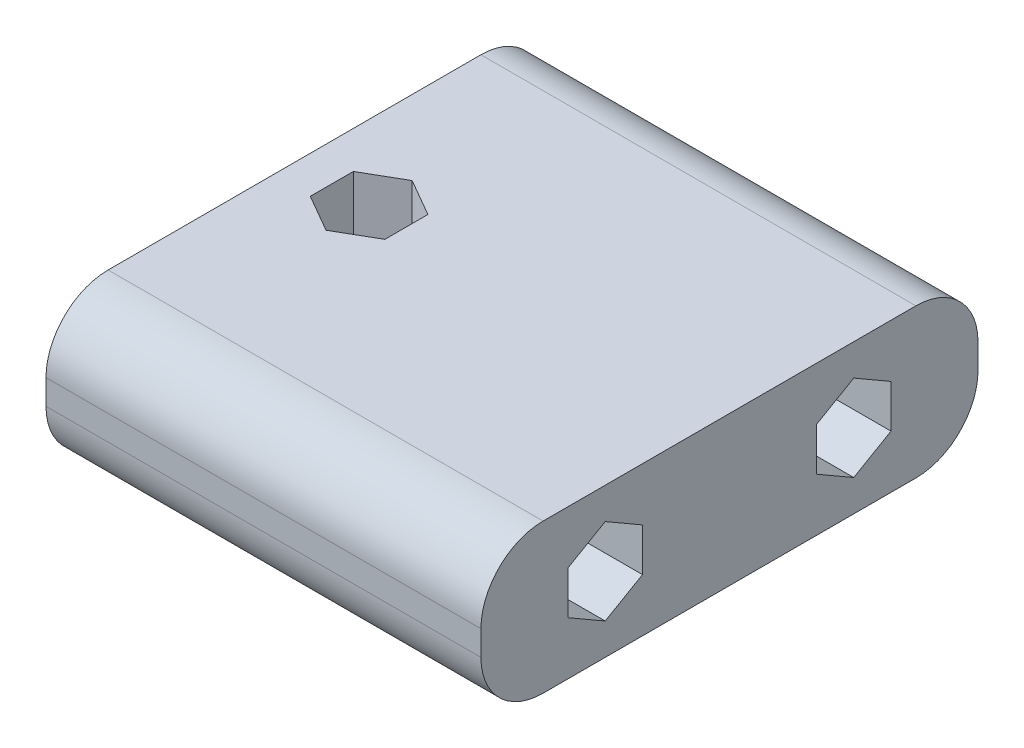
ISO-10303-21;
HEADER;
FILE_DESCRIPTION(('STEP AP214'),'2;1');
FILE_NAME('part.step','',(''),(''),'','','');
FILE_SCHEMA(('AUTOMOTIVE_DESIGN { 1 0 10303 214 1 1 1 1 }'));
ENDSEC;
DATA;
#1=APPLICATION_CONTEXT('core data for automotive mechanical design processes');
#2=APPLICATION_PROTOCOL_DEFINITION('international standard','automotive_design',2000,#1);
#3=PRODUCT_CONTEXT('',#1,'mechanical');
#4=PRODUCT('Part','Part','',(#3));
#5=PRODUCT_RELATED_PRODUCT_CATEGORY('part','',(#4));
#6=PRODUCT_DEFINITION_FORMATION('','',#4);
#7=PRODUCT_DEFINITION_CONTEXT('part definition',#1,'design');
#8=PRODUCT_DEFINITION('design','',#6,#7);
#9=PRODUCT_DEFINITION_SHAPE('','',#8);
#10=(LENGTH_UNIT() NAMED_UNIT(*) SI_UNIT(.MILLI.,.METRE.));
#11=(NAMED_UNIT(*) PLANE_ANGLE_UNIT() SI_UNIT($,.RADIAN.));
#12=(NAMED_UNIT(*) SI_UNIT($,.STERADIAN.) SOLID_ANGLE_UNIT());
#13=UNCERTAINTY_MEASURE_WITH_UNIT(LENGTH_MEASURE(1.E-05),#10,'distance_accuracy_value','');
#14=(GEOMETRIC_REPRESENTATION_CONTEXT(3) GLOBAL_UNCERTAINTY_ASSIGNED_CONTEXT((#13)) GLOBAL_UNIT_ASSIGNED_CONTEXT((#10,
#11,#12)) REPRESENTATION_CONTEXT('',''));
#15=CARTESIAN_POINT('',(0.,0.,0.));
#16=DIRECTION('',(0.,0.,1.));
#17=DIRECTION('',(1.,0.,0.));
#18=AXIS2_PLACEMENT_3D('',#15,#16,#17);
#19=CARTESIAN_POINT('',(35.,0.,0.));
#20=DIRECTION('',(-1.,0.,0.));
#21=DIRECTION('',(0.,0.,1.));
#22=AXIS2_PLACEMENT_3D('',#19,#20,#21);
#23=PLANE('',#22);
#24=DIRECTION('',(0.,0.5,0.866025403784439));
#25=VECTOR('',#24,1.);
#26=CARTESIAN_POINT('',(35.,7.73205080756886,-33.));
#27=LINE('',#26,#25);
#28=CARTESIAN_POINT('',(35.,7.73205080756886,-33.));
#29=VERTEX_POINT('',#28);
#30=CARTESIAN_POINT('',(35.,9.46410161513774,-30.));
#31=VERTEX_POINT('',#30);
#32=EDGE_CURVE('E301',#29,#31,#27,.T.);
#33=ORIENTED_EDGE('',*,*,#32,.F.);
#34=DIRECTION('',(0.,1.,0.));
#35=VECTOR('',#34,1.);
#36=CARTESIAN_POINT('',(35.,4.26794919243112,-33.));
#37=LINE('',#36,#35);
#38=CARTESIAN_POINT('',(35.,4.26794919243112,-33.));
#39=VERTEX_POINT('',#38);
#40=EDGE_CURVE('E312',#39,#29,#37,.T.);
#41=ORIENTED_EDGE('',*,*,#40,.F.);
#42=DIRECTION('',(0.,0.5,-0.866025403784438));
#43=VECTOR('',#42,1.);
#44=CARTESIAN_POINT('',(35.,2.53589838486224,-30.));
#45=LINE('',#44,#43);
#46=CARTESIAN_POINT('',(35.,2.53589838486224,-30.));
#47=VERTEX_POINT('',#46);
#48=EDGE_CURVE('E309',#47,#39,#45,.T.);
#49=ORIENTED_EDGE('',*,*,#48,.F.);
#50=DIRECTION('',(0.,-0.500000000000001,-0.866025403784438));
#51=VECTOR('',#50,1.);
#52=CARTESIAN_POINT('',(35.,4.26794919243112,-27.));
#53=LINE('',#52,#51);
#54=CARTESIAN_POINT('',(35.,4.26794919243112,-27.));
#55=VERTEX_POINT('',#54);
#56=EDGE_CURVE('E307',#55,#47,#53,.T.);
#57=ORIENTED_EDGE('',*,*,#56,.F.);
#58=DIRECTION('',(0.,-1.,0.));
#59=VECTOR('',#58,1.);
#60=CARTESIAN_POINT('',(35.,7.73205080756887,-27.));
#61=LINE('',#60,#59);
#62=CARTESIAN_POINT('',(35.,7.73205080756887,-27.));
#63=VERTEX_POINT('',#62);
#64=EDGE_CURVE('E305',#63,#55,#61,.T.);
#65=ORIENTED_EDGE('',*,*,#64,.F.);
#66=DIRECTION('',(0.,-0.5,0.866025403784439));
#67=VECTOR('',#66,1.);
#68=CARTESIAN_POINT('',(35.,9.46410161513774,-30.));
#69=LINE('',#68,#67);
#70=EDGE_CURVE('E303',#31,#63,#69,.T.);
#71=ORIENTED_EDGE('',*,*,#70,.F.);
#72=EDGE_LOOP('',(#33,#41,#49,#57,#65,#71));
#73=FACE_BOUND('',#72,.T.);
#74=DIRECTION('',(0.,0.,-1.));
#75=VECTOR('',#74,1.);
#76=CARTESIAN_POINT('',(35.,0.,0.));
#77=LINE('',#76,#75);
#78=CARTESIAN_POINT('',(35.,0.,-5.));
#79=VERTEX_POINT('',#78);
#80=CARTESIAN_POINT('',(35.,0.,-35.));
#81=VERTEX_POINT('',#80);
#82=EDGE_CURVE('E335',#79,#81,#77,.T.);
#83=ORIENTED_EDGE('',*,*,#82,.T.);
#84=CARTESIAN_POINT('',(35.,5.,-35.));
#85=DIRECTION('',(-1.,0.,0.));
#86=DIRECTION('',(0.,0.,1.));
#87=AXIS2_PLACEMENT_3D('',#84,#85,#86);
#88=CIRCLE('',#87,5.);
#89=CARTESIAN_POINT('',(35.,5.,-40.));
#90=VERTEX_POINT('',#89);
#91=EDGE_CURVE('E379',#81,#90,#88,.F.);
#92=ORIENTED_EDGE('',*,*,#91,.T.);
#93=DIRECTION('',(0.,1.,0.));
#94=VECTOR('',#93,1.);
#95=CARTESIAN_POINT('',(35.,0.,-40.));
#96=LINE('',#95,#94);
#97=CARTESIAN_POINT('',(35.,7.,-40.));
#98=VERTEX_POINT('',#97);
#99=EDGE_CURVE('E339',#90,#98,#96,.T.);
#100=ORIENTED_EDGE('',*,*,#99,.T.);
#101=CARTESIAN_POINT('',(35.,7.,-35.));
#102=DIRECTION('',(-1.,0.,0.));
#103=DIRECTION('',(0.,0.,1.));
#104=AXIS2_PLACEMENT_3D('',#101,#102,#103);
#105=CIRCLE('',#104,5.);
#106=CARTESIAN_POINT('',(35.,12.,-35.));
#107=VERTEX_POINT('',#106);
#108=EDGE_CURVE('E377',#98,#107,#105,.F.);
#109=ORIENTED_EDGE('',*,*,#108,.T.);
#110=DIRECTION('',(0.,0.,1.));
#111=VECTOR('',#110,1.);
#112=CARTESIAN_POINT('',(35.,12.,0.));
#113=LINE('',#112,#111);
#114=CARTESIAN_POINT('',(35.,12.,-5.));
#115=VERTEX_POINT('',#114);
#116=EDGE_CURVE('E342',#107,#115,#113,.T.);
#117=ORIENTED_EDGE('',*,*,#116,.T.);
#118=CARTESIAN_POINT('',(35.,7.,-5.));
#119=DIRECTION('',(-1.,0.,0.));
#120=DIRECTION('',(0.,0.,1.));
#121=AXIS2_PLACEMENT_3D('',#118,#119,#120);
#122=CIRCLE('',#121,5.);
#123=CARTESIAN_POINT('',(35.,7.,0.));
#124=VERTEX_POINT('',#123);
#125=EDGE_CURVE('E373',#115,#124,#122,.F.);
#126=ORIENTED_EDGE('',*,*,#125,.T.);
#127=DIRECTION('',(0.,-1.,0.));
#128=VECTOR('',#127,1.);
#129=CARTESIAN_POINT('',(35.,0.,0.));
#130=LINE('',#129,#128);
#131=CARTESIAN_POINT('',(35.,5.,0.));
#132=VERTEX_POINT('',#131);
#133=EDGE_CURVE('E332',#124,#132,#130,.T.);
#134=ORIENTED_EDGE('',*,*,#133,.T.);
#135=CARTESIAN_POINT('',(35.,5.,-5.));
#136=DIRECTION('',(-1.,0.,0.));
#137=DIRECTION('',(0.,0.,1.));
#138=AXIS2_PLACEMENT_3D('',#135,#136,#137);
#139=CIRCLE('',#138,5.);
#140=EDGE_CURVE('E375',#132,#79,#139,.F.);
#141=ORIENTED_EDGE('',*,*,#140,.T.);
#142=EDGE_LOOP('',(#83,#92,#100,#109,#117,#126,#134,#141));
#143=FACE_BOUND('',#142,.T.);
#144=DIRECTION('',(0.,0.5,0.866025403784438));
#145=VECTOR('',#144,1.);
#146=CARTESIAN_POINT('',(35.,7.73205080756888,-13.));
#147=LINE('',#146,#145);
#148=CARTESIAN_POINT('',(35.,7.73205080756888,-13.));
#149=VERTEX_POINT('',#148);
#150=CARTESIAN_POINT('',(35.,9.46410161513776,-10.));
#151=VERTEX_POINT('',#150);
#152=EDGE_CURVE('E270',#149,#151,#147,.T.);
#153=ORIENTED_EDGE('',*,*,#152,.F.);
#154=DIRECTION('',(0.,1.,0.));
#155=VECTOR('',#154,1.);
#156=CARTESIAN_POINT('',(35.,4.26794919243113,-13.));
#157=LINE('',#156,#155);
#158=CARTESIAN_POINT('',(35.,4.26794919243113,-13.));
#159=VERTEX_POINT('',#158);
#160=EDGE_CURVE('E215',#159,#149,#157,.T.);
#161=ORIENTED_EDGE('',*,*,#160,.F.);
#162=DIRECTION('',(0.,0.5,-0.866025403784439));
#163=VECTOR('',#162,1.);
#164=CARTESIAN_POINT('',(35.,2.53589838486225,-10.));
#165=LINE('',#164,#163);
#166=CARTESIAN_POINT('',(35.,2.53589838486225,-10.));
#167=VERTEX_POINT('',#166);
#168=EDGE_CURVE('E288',#167,#159,#165,.T.);
#169=ORIENTED_EDGE('',*,*,#168,.F.);
#170=DIRECTION('',(0.,-0.5,-0.866025403784438));
#171=VECTOR('',#170,1.);
#172=CARTESIAN_POINT('',(35.,4.26794919243112,-7.));
#173=LINE('',#172,#171);
#174=CARTESIAN_POINT('',(35.,4.26794919243112,-7.));
#175=VERTEX_POINT('',#174);
#176=EDGE_CURVE('E286',#175,#167,#173,.T.);
#177=ORIENTED_EDGE('',*,*,#176,.F.);
#178=DIRECTION('',(0.,-1.,0.));
#179=VECTOR('',#178,1.);
#180=CARTESIAN_POINT('',(35.,7.73205080756887,-7.));
#181=LINE('',#180,#179);
#182=CARTESIAN_POINT('',(35.,7.73205080756887,-7.));
#183=VERTEX_POINT('',#182);
#184=EDGE_CURVE('E284',#183,#175,#181,.T.);
#185=ORIENTED_EDGE('',*,*,#184,.F.);
#186=DIRECTION('',(0.,-0.500000000000001,0.866025403784438));
#187=VECTOR('',#186,1.);
#188=CARTESIAN_POINT('',(35.,9.46410161513776,-10.));
#189=LINE('',#188,#187);
#190=EDGE_CURVE('E282',#151,#183,#189,.T.);
#191=ORIENTED_EDGE('',*,*,#190,.F.);
#192=EDGE_LOOP('',(#153,#161,#169,#177,#185,#191));
#193=FACE_BOUND('',#192,.T.);
#194=ADVANCED_FACE('F33',(#73,#143,#193),#23,.F.);
#195=CARTESIAN_POINT('',(0.,0.,0.));
#196=DIRECTION('',(-1.,0.,0.));
#197=DIRECTION('',(0.,0.,1.));
#198=AXIS2_PLACEMENT_3D('',#195,#196,#197);
#199=PLANE('',#198);
#200=DIRECTION('',(0.,1.,0.));
#201=VECTOR('',#200,1.);
#202=CARTESIAN_POINT('',(0.,0.,-40.));
#203=LINE('',#202,#201);
#204=CARTESIAN_POINT('',(0.,5.,-40.));
#205=VERTEX_POINT('',#204);
#206=CARTESIAN_POINT('',(0.,7.,-40.));
#207=VERTEX_POINT('',#206);
#208=EDGE_CURVE('E351',#205,#207,#203,.T.);
#209=ORIENTED_EDGE('',*,*,#208,.F.);
#210=CARTESIAN_POINT('',(0.,5.,-35.));
#211=DIRECTION('',(-1.,0.,0.));
#212=DIRECTION('',(0.,0.,1.));
#213=AXIS2_PLACEMENT_3D('',#210,#211,#212);
#214=CIRCLE('',#213,5.);
#215=CARTESIAN_POINT('',(0.,0.,-35.));
#216=VERTEX_POINT('',#215);
#217=EDGE_CURVE('E366',#205,#216,#214,.T.);
#218=ORIENTED_EDGE('',*,*,#217,.T.);
#219=DIRECTION('',(0.,0.,-1.));
#220=VECTOR('',#219,1.);
#221=CARTESIAN_POINT('',(0.,0.,0.));
#222=LINE('',#221,#220);
#223=CARTESIAN_POINT('',(0.,0.,-5.));
#224=VERTEX_POINT('',#223);
#225=EDGE_CURVE('E348',#224,#216,#222,.T.);
#226=ORIENTED_EDGE('',*,*,#225,.F.);
#227=CARTESIAN_POINT('',(0.,5.,-5.));
#228=DIRECTION('',(-1.,0.,0.));
#229=DIRECTION('',(0.,0.,1.));
#230=AXIS2_PLACEMENT_3D('',#227,#228,#229);
#231=CIRCLE('',#230,5.);
#232=CARTESIAN_POINT('',(0.,5.,0.));
#233=VERTEX_POINT('',#232);
#234=EDGE_CURVE('E362',#224,#233,#231,.T.);
#235=ORIENTED_EDGE('',*,*,#234,.T.);
#236=DIRECTION('',(0.,-1.,0.));
#237=VECTOR('',#236,1.);
#238=CARTESIAN_POINT('',(0.,0.,0.));
#239=LINE('',#238,#237);
#240=CARTESIAN_POINT('',(0.,7.,0.));
#241=VERTEX_POINT('',#240);
#242=EDGE_CURVE('E331',#241,#233,#239,.T.);
#243=ORIENTED_EDGE('',*,*,#242,.F.);
#244=CARTESIAN_POINT('',(0.,7.,-5.));
#245=DIRECTION('',(-1.,0.,0.));
#246=DIRECTION('',(0.,0.,1.));
#247=AXIS2_PLACEMENT_3D('',#244,#245,#246);
#248=CIRCLE('',#247,5.);
#249=CARTESIAN_POINT('',(0.,12.,-5.));
#250=VERTEX_POINT('',#249);
#251=EDGE_CURVE('E360',#241,#250,#248,.T.);
#252=ORIENTED_EDGE('',*,*,#251,.T.);
#253=DIRECTION('',(0.,0.,1.));
#254=VECTOR('',#253,1.);
#255=CARTESIAN_POINT('',(0.,12.,0.));
#256=LINE('',#255,#254);
#257=CARTESIAN_POINT('',(0.,12.,-35.));
#258=VERTEX_POINT('',#257);
#259=EDGE_CURVE('E336',#258,#250,#256,.T.);
#260=ORIENTED_EDGE('',*,*,#259,.F.);
#261=CARTESIAN_POINT('',(0.,7.,-35.));
#262=DIRECTION('',(-1.,0.,0.));
#263=DIRECTION('',(0.,0.,1.));
#264=AXIS2_PLACEMENT_3D('',#261,#262,#263);
#265=CIRCLE('',#264,5.);
#266=EDGE_CURVE('E364',#258,#207,#265,.T.);
#267=ORIENTED_EDGE('',*,*,#266,.T.);
#268=EDGE_LOOP('',(#209,#218,#226,#235,#243,#252,#260,#267));
#269=FACE_BOUND('',#268,.T.);
#270=ADVANCED_FACE('F442',(#269),#199,.T.);
#271=CARTESIAN_POINT('',(35.,0.,0.));
#272=DIRECTION('',(0.,0.,-1.));
#273=DIRECTION('',(-1.,0.,0.));
#274=AXIS2_PLACEMENT_3D('',#271,#272,#273);
#275=PLANE('',#274);
#276=ORIENTED_EDGE('',*,*,#242,.T.);
#277=DIRECTION('',(-1.,0.,0.));
#278=VECTOR('',#277,1.);
#279=CARTESIAN_POINT('',(35.,5.,0.));
#280=LINE('',#279,#278);
#281=EDGE_CURVE('E389',#233,#132,#280,.F.);
#282=ORIENTED_EDGE('',*,*,#281,.T.);
#283=ORIENTED_EDGE('',*,*,#133,.F.);
#284=DIRECTION('',(-1.,0.,0.));
#285=VECTOR('',#284,1.);
#286=CARTESIAN_POINT('',(35.,7.,0.));
#287=LINE('',#286,#285);
#288=EDGE_CURVE('E386',#124,#241,#287,.T.);
#289=ORIENTED_EDGE('',*,*,#288,.T.);
#290=EDGE_LOOP('',(#276,#282,#283,#289));
#291=FACE_BOUND('',#290,.T.);
#292=ADVANCED_FACE('F448',(#291),#275,.F.);
#293=CARTESIAN_POINT('',(35.,0.,0.));
#294=DIRECTION('',(0.,1.,0.));
#295=DIRECTION('',(0.,0.,1.));
#296=AXIS2_PLACEMENT_3D('',#293,#294,#295);
#297=PLANE('',#296);
#298=DIRECTION('',(-0.866025403784439,0.,-0.5));
#299=VECTOR('',#298,1.);
#300=CARTESIAN_POINT('',(6.,0.,-16.5358983848622));
#301=LINE('',#300,#299);
#302=CARTESIAN_POINT('',(6.,0.,-16.5358983848622));
#303=VERTEX_POINT('',#302);
#304=CARTESIAN_POINT('',(3.,0.,-18.2679491924311));
#305=VERTEX_POINT('',#304);
#306=EDGE_CURVE('E252',#303,#305,#301,.T.);
#307=ORIENTED_EDGE('',*,*,#306,.F.);
#308=DIRECTION('',(-0.866025403784439,0.,0.5));
#309=VECTOR('',#308,1.);
#310=CARTESIAN_POINT('',(9.00000000000001,0.,-18.2679491924311));
#311=LINE('',#310,#309);
#312=CARTESIAN_POINT('',(9.00000000000001,0.,-18.2679491924311));
#313=VERTEX_POINT('',#312);
#314=EDGE_CURVE('E250',#313,#303,#311,.T.);
#315=ORIENTED_EDGE('',*,*,#314,.F.);
#316=DIRECTION('',(0.,0.,1.));
#317=VECTOR('',#316,1.);
#318=CARTESIAN_POINT('',(9.00000000000001,0.,-21.7320508075689));
#319=LINE('',#318,#317);
#320=CARTESIAN_POINT('',(9.00000000000001,0.,-21.7320508075689));
#321=VERTEX_POINT('',#320);
#322=EDGE_CURVE('E264',#321,#313,#319,.T.);
#323=ORIENTED_EDGE('',*,*,#322,.F.);
#324=DIRECTION('',(0.866025403784438,0.,0.5));
#325=VECTOR('',#324,1.);
#326=CARTESIAN_POINT('',(6.,0.,-23.4641016151378));
#327=LINE('',#326,#325);
#328=CARTESIAN_POINT('',(6.,0.,-23.4641016151378));
#329=VERTEX_POINT('',#328);
#330=EDGE_CURVE('E261',#329,#321,#327,.T.);
#331=ORIENTED_EDGE('',*,*,#330,.F.);
#332=DIRECTION('',(0.866025403784438,0.,-0.5));
#333=VECTOR('',#332,1.);
#334=CARTESIAN_POINT('',(3.,0.,-21.7320508075689));
#335=LINE('',#334,#333);
#336=CARTESIAN_POINT('',(3.,0.,-21.7320508075689));
#337=VERTEX_POINT('',#336);
#338=EDGE_CURVE('E258',#337,#329,#335,.T.);
#339=ORIENTED_EDGE('',*,*,#338,.F.);
#340=DIRECTION('',(0.,0.,-1.));
#341=VECTOR('',#340,1.);
#342=CARTESIAN_POINT('',(3.,0.,-18.2679491924311));
#343=LINE('',#342,#341);
#344=EDGE_CURVE('E255',#305,#337,#343,.T.);
#345=ORIENTED_EDGE('',*,*,#344,.F.);
#346=EDGE_LOOP('',(#307,#315,#323,#331,#339,#345));
#347=FACE_BOUND('',#346,.T.);
#348=ORIENTED_EDGE('',*,*,#225,.T.);
#349=DIRECTION('',(-1.,0.,0.));
#350=VECTOR('',#349,1.);
#351=CARTESIAN_POINT('',(35.,0.,-35.));
#352=LINE('',#351,#350);
#353=EDGE_CURVE('E371',#216,#81,#352,.F.);
#354=ORIENTED_EDGE('',*,*,#353,.T.);
#355=ORIENTED_EDGE('',*,*,#82,.F.);
#356=DIRECTION('',(-1.,0.,0.));
#357=VECTOR('',#356,1.);
#358=CARTESIAN_POINT('',(35.,0.,-5.));
#359=LINE('',#358,#357);
#360=EDGE_CURVE('E368',#79,#224,#359,.T.);
#361=ORIENTED_EDGE('',*,*,#360,.T.);
#362=EDGE_LOOP('',(#348,#354,#355,#361));
#363=FACE_BOUND('',#362,.T.);
#364=ADVANCED_FACE('F419',(#347,#363),#297,.F.);
#365=CARTESIAN_POINT('',(35.,0.,-40.));
#366=DIRECTION('',(0.,0.,1.));
#367=DIRECTION('',(1.,0.,0.));
#368=AXIS2_PLACEMENT_3D('',#365,#366,#367);
#369=PLANE('',#368);
#370=ORIENTED_EDGE('',*,*,#99,.F.);
#371=DIRECTION('',(-1.,0.,0.));
#372=VECTOR('',#371,1.);
#373=CARTESIAN_POINT('',(35.,5.,-40.));
#374=LINE('',#373,#372);
#375=EDGE_CURVE('E357',#90,#205,#374,.T.);
#376=ORIENTED_EDGE('',*,*,#375,.T.);
#377=ORIENTED_EDGE('',*,*,#208,.T.);
#378=DIRECTION('',(-1.,0.,0.));
#379=VECTOR('',#378,1.);
#380=CARTESIAN_POINT('',(35.,7.,-40.));
#381=LINE('',#380,#379);
#382=EDGE_CURVE('E345',#207,#98,#381,.F.);
#383=ORIENTED_EDGE('',*,*,#382,.T.);
#384=EDGE_LOOP('',(#370,#376,#377,#383));
#385=FACE_BOUND('',#384,.T.);
#386=ADVANCED_FACE('F459',(#385),#369,.F.);
#387=CARTESIAN_POINT('',(35.,12.,0.));
#388=DIRECTION('',(0.,-1.,0.));
#389=DIRECTION('',(0.,0.,-1.));
#390=AXIS2_PLACEMENT_3D('',#387,#388,#389);
#391=PLANE('',#390);
#392=DIRECTION('',(0.,0.,1.));
#393=VECTOR('',#392,1.);
#394=CARTESIAN_POINT('',(9.00000000000001,12.,0.));
#395=LINE('',#394,#393);
#396=CARTESIAN_POINT('',(9.00000000000001,12.,-21.7320508075689));
#397=VERTEX_POINT('',#396);
#398=CARTESIAN_POINT('',(9.00000000000001,12.,-18.2679491924311));
#399=VERTEX_POINT('',#398);
#400=EDGE_CURVE('E41',#397,#399,#395,.T.);
#401=ORIENTED_EDGE('',*,*,#400,.T.);
#402=DIRECTION('',(-0.866025403784439,0.,0.5));
#403=VECTOR('',#402,1.);
#404=CARTESIAN_POINT('',(20.5897459621556,12.,-24.959292143521));
#405=LINE('',#404,#403);
#406=CARTESIAN_POINT('',(6.,12.,-16.5358983848622));
#407=VERTEX_POINT('',#406);
#408=EDGE_CURVE('E11',#399,#407,#405,.T.);
#409=ORIENTED_EDGE('',*,*,#408,.T.);
#410=DIRECTION('',(-0.866025403784439,0.,-0.5));
#411=VECTOR('',#410,1.);
#412=CARTESIAN_POINT('',(34.9102540378444,12.,0.155444566227682));
#413=LINE('',#412,#411);
#414=CARTESIAN_POINT('',(3.,12.,-18.2679491924311));
#415=VERTEX_POINT('',#414);
#416=EDGE_CURVE('E391',#407,#415,#413,.T.);
#417=ORIENTED_EDGE('',*,*,#416,.T.);
#418=DIRECTION('',(0.,0.,-1.));
#419=VECTOR('',#418,1.);
#420=CARTESIAN_POINT('',(3.,12.,0.));
#421=LINE('',#420,#419);
#422=CARTESIAN_POINT('',(3.,12.,-21.7320508075689));
#423=VERTEX_POINT('',#422);
#424=EDGE_CURVE('E394',#415,#423,#421,.T.);
#425=ORIENTED_EDGE('',*,*,#424,.T.);
#426=DIRECTION('',(0.866025403784438,0.,-0.500000000000001));
#427=VECTOR('',#426,1.);
#428=CARTESIAN_POINT('',(17.5897459621556,12.,-30.1554445662277));
#429=LINE('',#428,#427);
#430=CARTESIAN_POINT('',(6.,12.,-23.4641016151378));
#431=VERTEX_POINT('',#430);
#432=EDGE_CURVE('E397',#423,#431,#429,.T.);
#433=ORIENTED_EDGE('',*,*,#432,.T.);
#434=DIRECTION('',(0.866025403784439,0.,0.5));
#435=VECTOR('',#434,1.);
#436=CARTESIAN_POINT('',(37.9102540378444,12.,-5.04070785647895));
#437=LINE('',#436,#435);
#438=EDGE_CURVE('E400',#431,#397,#437,.T.);
#439=ORIENTED_EDGE('',*,*,#438,.T.);
#440=EDGE_LOOP('',(#401,#409,#417,#425,#433,#439));
#441=FACE_BOUND('',#440,.T.);
#442=ORIENTED_EDGE('',*,*,#116,.F.);
#443=DIRECTION('',(-1.,0.,0.));
#444=VECTOR('',#443,1.);
#445=CARTESIAN_POINT('',(35.,12.,-35.));
#446=LINE('',#445,#444);
#447=EDGE_CURVE('E383',#107,#258,#446,.T.);
#448=ORIENTED_EDGE('',*,*,#447,.T.);
#449=ORIENTED_EDGE('',*,*,#259,.T.);
#450=DIRECTION('',(-1.,0.,0.));
#451=VECTOR('',#450,1.);
#452=CARTESIAN_POINT('',(35.,12.,-5.));
#453=LINE('',#452,#451);
#454=EDGE_CURVE('E381',#250,#115,#453,.F.);
#455=ORIENTED_EDGE('',*,*,#454,.T.);
#456=EDGE_LOOP('',(#442,#448,#449,#455));
#457=FACE_BOUND('',#456,.T.);
#458=ADVANCED_FACE('F404',(#441,#457),#391,.F.);
#459=CARTESIAN_POINT('',(35.,7.73205080756886,-33.));
#460=DIRECTION('',(0.,-0.866025403784439,0.5));
#461=DIRECTION('',(0.,-0.5,-0.866025403784439));
#462=AXIS2_PLACEMENT_3D('',#459,#460,#461);
#463=PLANE('',#462);
#464=DIRECTION('',(0.,-0.5,-0.866025403784439));
#465=VECTOR('',#464,1.);
#466=CARTESIAN_POINT('',(10.,7.73205080756886,-33.));
#467=LINE('',#466,#465);
#468=CARTESIAN_POINT('',(10.,9.46410161513774,-30.));
#469=VERTEX_POINT('',#468);
#470=CARTESIAN_POINT('',(10.,7.73205080756886,-33.));
#471=VERTEX_POINT('',#470);
#472=EDGE_CURVE('E237',#469,#471,#467,.T.);
#473=ORIENTED_EDGE('',*,*,#472,.T.);
#474=DIRECTION('',(-1.,0.,0.));
#475=VECTOR('',#474,1.);
#476=CARTESIAN_POINT('',(35.,7.73205080756886,-33.));
#477=LINE('',#476,#475);
#478=EDGE_CURVE('E314',#29,#471,#477,.T.);
#479=ORIENTED_EDGE('',*,*,#478,.F.);
#480=ORIENTED_EDGE('',*,*,#32,.T.);
#481=DIRECTION('',(-1.,0.,0.));
#482=VECTOR('',#481,1.);
#483=CARTESIAN_POINT('',(35.,9.46410161513774,-30.));
#484=LINE('',#483,#482);
#485=EDGE_CURVE('E328',#31,#469,#484,.T.);
#486=ORIENTED_EDGE('',*,*,#485,.T.);
#487=EDGE_LOOP('',(#473,#479,#480,#486));
#488=FACE_BOUND('',#487,.T.);
#489=ADVANCED_FACE('F454',(#488),#463,.T.);
#490=CARTESIAN_POINT('',(35.,9.46410161513774,-30.));
#491=DIRECTION('',(0.,-0.866025403784439,-0.5));
#492=DIRECTION('',(0.,0.5,-0.866025403784438));
#493=AXIS2_PLACEMENT_3D('',#490,#491,#492);
#494=PLANE('',#493);
#495=DIRECTION('',(0.,0.5,-0.866025403784439));
#496=VECTOR('',#495,1.);
#497=CARTESIAN_POINT('',(10.,9.46410161513774,-30.));
#498=LINE('',#497,#496);
#499=CARTESIAN_POINT('',(10.,7.73205080756887,-27.));
#500=VERTEX_POINT('',#499);
#501=EDGE_CURVE('E248',#500,#469,#498,.T.);
#502=ORIENTED_EDGE('',*,*,#501,.T.);
#503=ORIENTED_EDGE('',*,*,#485,.F.);
#504=ORIENTED_EDGE('',*,*,#70,.T.);
#505=DIRECTION('',(-1.,0.,0.));
#506=VECTOR('',#505,1.);
#507=CARTESIAN_POINT('',(35.,7.73205080756887,-27.));
#508=LINE('',#507,#506);
#509=EDGE_CURVE('E325',#63,#500,#508,.T.);
#510=ORIENTED_EDGE('',*,*,#509,.T.);
#511=EDGE_LOOP('',(#502,#503,#504,#510));
#512=FACE_BOUND('',#511,.T.);
#513=ADVANCED_FACE('F545',(#512),#494,.T.);
#514=CARTESIAN_POINT('',(35.,7.73205080756887,-27.));
#515=DIRECTION('',(0.,0.,-1.));
#516=DIRECTION('',(-1.,0.,0.));
#517=AXIS2_PLACEMENT_3D('',#514,#515,#516);
#518=PLANE('',#517);
#519=DIRECTION('',(0.,1.,0.));
#520=VECTOR('',#519,1.);
#521=CARTESIAN_POINT('',(10.,7.73205080756887,-27.));
#522=LINE('',#521,#520);
#523=CARTESIAN_POINT('',(10.,4.26794919243112,-27.));
#524=VERTEX_POINT('',#523);
#525=EDGE_CURVE('E246',#524,#500,#522,.T.);
#526=ORIENTED_EDGE('',*,*,#525,.T.);
#527=ORIENTED_EDGE('',*,*,#509,.F.);
#528=ORIENTED_EDGE('',*,*,#64,.T.);
#529=DIRECTION('',(-1.,0.,0.));
#530=VECTOR('',#529,1.);
#531=CARTESIAN_POINT('',(35.,4.26794919243112,-27.));
#532=LINE('',#531,#530);
#533=EDGE_CURVE('E322',#55,#524,#532,.T.);
#534=ORIENTED_EDGE('',*,*,#533,.T.);
#535=EDGE_LOOP('',(#526,#527,#528,#534));
#536=FACE_BOUND('',#535,.T.);
#537=ADVANCED_FACE('F542',(#536),#518,.T.);
#538=CARTESIAN_POINT('',(35.,4.26794919243112,-27.));
#539=DIRECTION('',(0.,0.866025403784438,-0.500000000000001));
#540=DIRECTION('',(0.,0.500000000000001,0.866025403784438));
#541=AXIS2_PLACEMENT_3D('',#538,#539,#540);
#542=PLANE('',#541);
#543=DIRECTION('',(0.,0.500000000000001,0.866025403784438));
#544=VECTOR('',#543,1.);
#545=CARTESIAN_POINT('',(10.,4.26794919243112,-27.));
#546=LINE('',#545,#544);
#547=CARTESIAN_POINT('',(10.,2.53589838486224,-30.));
#548=VERTEX_POINT('',#547);
#549=EDGE_CURVE('E244',#548,#524,#546,.T.);
#550=ORIENTED_EDGE('',*,*,#549,.T.);
#551=ORIENTED_EDGE('',*,*,#533,.F.);
#552=ORIENTED_EDGE('',*,*,#56,.T.);
#553=DIRECTION('',(-1.,0.,0.));
#554=VECTOR('',#553,1.);
#555=CARTESIAN_POINT('',(35.,2.53589838486224,-30.));
#556=LINE('',#555,#554);
#557=EDGE_CURVE('E319',#47,#548,#556,.T.);
#558=ORIENTED_EDGE('',*,*,#557,.T.);
#559=EDGE_LOOP('',(#550,#551,#552,#558));
#560=FACE_BOUND('',#559,.T.);
#561=ADVANCED_FACE('F538',(#560),#542,.T.);
#562=CARTESIAN_POINT('',(35.,2.53589838486224,-30.));
#563=DIRECTION('',(0.,0.866025403784438,0.5));
#564=DIRECTION('',(0.,-0.5,0.866025403784438));
#565=AXIS2_PLACEMENT_3D('',#562,#563,#564);
#566=PLANE('',#565);
#567=DIRECTION('',(0.,-0.5,0.866025403784438));
#568=VECTOR('',#567,1.);
#569=CARTESIAN_POINT('',(10.,2.53589838486224,-30.));
#570=LINE('',#569,#568);
#571=CARTESIAN_POINT('',(10.,4.26794919243112,-33.));
#572=VERTEX_POINT('',#571);
#573=EDGE_CURVE('E242',#572,#548,#570,.T.);
#574=ORIENTED_EDGE('',*,*,#573,.T.);
#575=ORIENTED_EDGE('',*,*,#557,.F.);
#576=ORIENTED_EDGE('',*,*,#48,.T.);
#577=DIRECTION('',(-1.,0.,0.));
#578=VECTOR('',#577,1.);
#579=CARTESIAN_POINT('',(35.,4.26794919243112,-33.));
#580=LINE('',#579,#578);
#581=EDGE_CURVE('E316',#39,#572,#580,.T.);
#582=ORIENTED_EDGE('',*,*,#581,.T.);
#583=EDGE_LOOP('',(#574,#575,#576,#582));
#584=FACE_BOUND('',#583,.T.);
#585=ADVANCED_FACE('F534',(#584),#566,.T.);
#586=CARTESIAN_POINT('',(35.,4.26794919243112,-33.));
#587=DIRECTION('',(0.,0.,1.));
#588=DIRECTION('',(1.,0.,0.));
#589=AXIS2_PLACEMENT_3D('',#586,#587,#588);
#590=PLANE('',#589);
#591=DIRECTION('',(0.,-1.,0.));
#592=VECTOR('',#591,1.);
#593=CARTESIAN_POINT('',(10.,4.26794919243112,-33.));
#594=LINE('',#593,#592);
#595=EDGE_CURVE('E240',#471,#572,#594,.T.);
#596=ORIENTED_EDGE('',*,*,#595,.T.);
#597=ORIENTED_EDGE('',*,*,#581,.F.);
#598=ORIENTED_EDGE('',*,*,#40,.T.);
#599=ORIENTED_EDGE('',*,*,#478,.T.);
#600=EDGE_LOOP('',(#596,#597,#598,#599));
#601=FACE_BOUND('',#600,.T.);
#602=ADVANCED_FACE('F531',(#601),#590,.T.);
#603=CARTESIAN_POINT('',(35.,7.73205080756888,-13.));
#604=DIRECTION('',(0.,-0.866025403784439,0.5));
#605=DIRECTION('',(0.,-0.5,-0.866025403784439));
#606=AXIS2_PLACEMENT_3D('',#603,#604,#605);
#607=PLANE('',#606);
#608=DIRECTION('',(0.,-0.5,-0.866025403784438));
#609=VECTOR('',#608,1.);
#610=CARTESIAN_POINT('',(10.,7.73205080756888,-13.));
#611=LINE('',#610,#609);
#612=CARTESIAN_POINT('',(10.,9.46410161513776,-10.));
#613=VERTEX_POINT('',#612);
#614=CARTESIAN_POINT('',(10.,7.73205080756888,-13.));
#615=VERTEX_POINT('',#614);
#616=EDGE_CURVE('E221',#613,#615,#611,.T.);
#617=ORIENTED_EDGE('',*,*,#616,.T.);
#618=DIRECTION('',(-1.,0.,0.));
#619=VECTOR('',#618,1.);
#620=CARTESIAN_POINT('',(35.,7.73205080756888,-13.));
#621=LINE('',#620,#619);
#622=EDGE_CURVE('E208',#149,#615,#621,.T.);
#623=ORIENTED_EDGE('',*,*,#622,.F.);
#624=ORIENTED_EDGE('',*,*,#152,.T.);
#625=DIRECTION('',(-1.,0.,0.));
#626=VECTOR('',#625,1.);
#627=CARTESIAN_POINT('',(35.,9.46410161513776,-10.));
#628=LINE('',#627,#626);
#629=EDGE_CURVE('E223',#151,#613,#628,.T.);
#630=ORIENTED_EDGE('',*,*,#629,.T.);
#631=EDGE_LOOP('',(#617,#623,#624,#630));
#632=FACE_BOUND('',#631,.T.);
#633=ADVANCED_FACE('F222',(#632),#607,.T.);
#634=CARTESIAN_POINT('',(35.,9.46410161513776,-10.));
#635=DIRECTION('',(0.,-0.866025403784438,-0.500000000000001));
#636=DIRECTION('',(0.,0.500000000000001,-0.866025403784438));
#637=AXIS2_PLACEMENT_3D('',#634,#635,#636);
#638=PLANE('',#637);
#639=DIRECTION('',(0.,0.500000000000001,-0.866025403784438));
#640=VECTOR('',#639,1.);
#641=CARTESIAN_POINT('',(10.,9.46410161513776,-10.));
#642=LINE('',#641,#640);
#643=CARTESIAN_POINT('',(10.,7.73205080756887,-7.));
#644=VERTEX_POINT('',#643);
#645=EDGE_CURVE('E48',#644,#613,#642,.T.);
#646=ORIENTED_EDGE('',*,*,#645,.T.);
#647=ORIENTED_EDGE('',*,*,#629,.F.);
#648=ORIENTED_EDGE('',*,*,#190,.T.);
#649=DIRECTION('',(-1.,0.,0.));
#650=VECTOR('',#649,1.);
#651=CARTESIAN_POINT('',(35.,7.73205080756887,-7.));
#652=LINE('',#651,#650);
#653=EDGE_CURVE('E298',#183,#644,#652,.T.);
#654=ORIENTED_EDGE('',*,*,#653,.T.);
#655=EDGE_LOOP('',(#646,#647,#648,#654));
#656=FACE_BOUND('',#655,.T.);
#657=ADVANCED_FACE('F506',(#656),#638,.T.);
#658=CARTESIAN_POINT('',(35.,7.73205080756887,-7.));
#659=DIRECTION('',(0.,0.,-1.));
#660=DIRECTION('',(-1.,0.,0.));
#661=AXIS2_PLACEMENT_3D('',#658,#659,#660);
#662=PLANE('',#661);
#663=DIRECTION('',(0.,1.,0.));
#664=VECTOR('',#663,1.);
#665=CARTESIAN_POINT('',(10.,7.73205080756887,-7.));
#666=LINE('',#665,#664);
#667=CARTESIAN_POINT('',(10.,4.26794919243112,-7.));
#668=VERTEX_POINT('',#667);
#669=EDGE_CURVE('E56',#668,#644,#666,.T.);
#670=ORIENTED_EDGE('',*,*,#669,.T.);
#671=ORIENTED_EDGE('',*,*,#653,.F.);
#672=ORIENTED_EDGE('',*,*,#184,.T.);
#673=DIRECTION('',(-1.,0.,0.));
#674=VECTOR('',#673,1.);
#675=CARTESIAN_POINT('',(35.,4.26794919243112,-7.));
#676=LINE('',#675,#674);
#677=EDGE_CURVE('E296',#175,#668,#676,.T.);
#678=ORIENTED_EDGE('',*,*,#677,.T.);
#679=EDGE_LOOP('',(#670,#671,#672,#678));
#680=FACE_BOUND('',#679,.T.);
#681=ADVANCED_FACE('F507',(#680),#662,.T.);
#682=CARTESIAN_POINT('',(35.,4.26794919243112,-7.));
#683=DIRECTION('',(0.,0.866025403784439,-0.5));
#684=DIRECTION('',(0.,0.5,0.866025403784439));
#685=AXIS2_PLACEMENT_3D('',#682,#683,#684);
#686=PLANE('',#685);
#687=DIRECTION('',(0.,0.5,0.866025403784438));
#688=VECTOR('',#687,1.);
#689=CARTESIAN_POINT('',(10.,4.26794919243112,-7.));
#690=LINE('',#689,#688);
#691=CARTESIAN_POINT('',(10.,2.53589838486225,-10.));
#692=VERTEX_POINT('',#691);
#693=EDGE_CURVE('E231',#692,#668,#690,.T.);
#694=ORIENTED_EDGE('',*,*,#693,.T.);
#695=ORIENTED_EDGE('',*,*,#677,.F.);
#696=ORIENTED_EDGE('',*,*,#176,.T.);
#697=DIRECTION('',(-1.,0.,0.));
#698=VECTOR('',#697,1.);
#699=CARTESIAN_POINT('',(35.,2.53589838486225,-10.));
#700=LINE('',#699,#698);
#701=EDGE_CURVE('E293',#167,#692,#700,.T.);
#702=ORIENTED_EDGE('',*,*,#701,.T.);
#703=EDGE_LOOP('',(#694,#695,#696,#702));
#704=FACE_BOUND('',#703,.T.);
#705=ADVANCED_FACE('F512',(#704),#686,.T.);
#706=CARTESIAN_POINT('',(35.,2.53589838486225,-10.));
#707=DIRECTION('',(0.,0.866025403784439,0.5));
#708=DIRECTION('',(0.,-0.5,0.866025403784439));
#709=AXIS2_PLACEMENT_3D('',#706,#707,#708);
#710=PLANE('',#709);
#711=DIRECTION('',(0.,-0.5,0.866025403784439));
#712=VECTOR('',#711,1.);
#713=CARTESIAN_POINT('',(10.,2.53589838486225,-10.));
#714=LINE('',#713,#712);
#715=CARTESIAN_POINT('',(10.,4.26794919243113,-13.));
#716=VERTEX_POINT('',#715);
#717=EDGE_CURVE('E229',#716,#692,#714,.T.);
#718=ORIENTED_EDGE('',*,*,#717,.T.);
#719=ORIENTED_EDGE('',*,*,#701,.F.);
#720=ORIENTED_EDGE('',*,*,#168,.T.);
#721=DIRECTION('',(-1.,0.,0.));
#722=VECTOR('',#721,1.);
#723=CARTESIAN_POINT('',(35.,4.26794919243113,-13.));
#724=LINE('',#723,#722);
#725=EDGE_CURVE('E218',#159,#716,#724,.T.);
#726=ORIENTED_EDGE('',*,*,#725,.T.);
#727=EDGE_LOOP('',(#718,#719,#720,#726));
#728=FACE_BOUND('',#727,.T.);
#729=ADVANCED_FACE('F514',(#728),#710,.T.);
#730=CARTESIAN_POINT('',(35.,4.26794919243113,-13.));
#731=DIRECTION('',(0.,0.,1.));
#732=DIRECTION('',(1.,0.,0.));
#733=AXIS2_PLACEMENT_3D('',#730,#731,#732);
#734=PLANE('',#733);
#735=DIRECTION('',(0.,-1.,0.));
#736=VECTOR('',#735,1.);
#737=CARTESIAN_POINT('',(10.,4.26794919243113,-13.));
#738=LINE('',#737,#736);
#739=EDGE_CURVE('E212',#615,#716,#738,.T.);
#740=ORIENTED_EDGE('',*,*,#739,.T.);
#741=ORIENTED_EDGE('',*,*,#725,.F.);
#742=ORIENTED_EDGE('',*,*,#160,.T.);
#743=ORIENTED_EDGE('',*,*,#622,.T.);
#744=EDGE_LOOP('',(#740,#741,#742,#743));
#745=FACE_BOUND('',#744,.T.);
#746=ADVANCED_FACE('F210',(#745),#734,.T.);
#747=CARTESIAN_POINT('',(35.,5.,-35.));
#748=DIRECTION('',(-1.,0.,0.));
#749=DIRECTION('',(0.,0.,1.));
#750=AXIS2_PLACEMENT_3D('',#747,#748,#749);
#751=CYLINDRICAL_SURFACE('',#750,5.);
#752=ORIENTED_EDGE('',*,*,#91,.F.);
#753=ORIENTED_EDGE('',*,*,#353,.F.);
#754=ORIENTED_EDGE('',*,*,#217,.F.);
#755=ORIENTED_EDGE('',*,*,#375,.F.);
#756=EDGE_LOOP('',(#752,#753,#754,#755));
#757=FACE_BOUND('',#756,.T.);
#758=ADVANCED_FACE('F468',(#757),#751,.T.);
#759=CARTESIAN_POINT('',(35.,7.,-35.));
#760=DIRECTION('',(-1.,0.,0.));
#761=DIRECTION('',(0.,0.,1.));
#762=AXIS2_PLACEMENT_3D('',#759,#760,#761);
#763=CYLINDRICAL_SURFACE('',#762,5.);
#764=ORIENTED_EDGE('',*,*,#108,.F.);
#765=ORIENTED_EDGE('',*,*,#382,.F.);
#766=ORIENTED_EDGE('',*,*,#266,.F.);
#767=ORIENTED_EDGE('',*,*,#447,.F.);
#768=EDGE_LOOP('',(#764,#765,#766,#767));
#769=FACE_BOUND('',#768,.T.);
#770=ADVANCED_FACE('F471',(#769),#763,.T.);
#771=CARTESIAN_POINT('',(35.,5.,-5.));
#772=DIRECTION('',(-1.,0.,0.));
#773=DIRECTION('',(0.,0.,1.));
#774=AXIS2_PLACEMENT_3D('',#771,#772,#773);
#775=CYLINDRICAL_SURFACE('',#774,5.);
#776=ORIENTED_EDGE('',*,*,#140,.F.);
#777=ORIENTED_EDGE('',*,*,#281,.F.);
#778=ORIENTED_EDGE('',*,*,#234,.F.);
#779=ORIENTED_EDGE('',*,*,#360,.F.);
#780=EDGE_LOOP('',(#776,#777,#778,#779));
#781=FACE_BOUND('',#780,.T.);
#782=ADVANCED_FACE('F474',(#781),#775,.T.);
#783=CARTESIAN_POINT('',(35.,7.,-5.));
#784=DIRECTION('',(-1.,0.,0.));
#785=DIRECTION('',(0.,0.,1.));
#786=AXIS2_PLACEMENT_3D('',#783,#784,#785);
#787=CYLINDRICAL_SURFACE('',#786,5.);
#788=ORIENTED_EDGE('',*,*,#125,.F.);
#789=ORIENTED_EDGE('',*,*,#454,.F.);
#790=ORIENTED_EDGE('',*,*,#251,.F.);
#791=ORIENTED_EDGE('',*,*,#288,.F.);
#792=EDGE_LOOP('',(#788,#789,#790,#791));
#793=FACE_BOUND('',#792,.T.);
#794=ADVANCED_FACE('F35',(#793),#787,.T.);
#795=CARTESIAN_POINT('',(9.00000000000001,20.,-18.2679491924311));
#796=DIRECTION('',(0.5,0.,0.866025403784439));
#797=DIRECTION('',(0.866025403784439,0.,-0.5));
#798=AXIS2_PLACEMENT_3D('',#795,#796,#797);
#799=PLANE('',#798);
#800=DIRECTION('',(0.,-1.,0.));
#801=VECTOR('',#800,1.);
#802=CARTESIAN_POINT('',(9.00000000000001,20.,-18.2679491924311));
#803=LINE('',#802,#801);
#804=EDGE_CURVE('E268',#399,#313,#803,.T.);
#805=ORIENTED_EDGE('',*,*,#804,.T.);
#806=ORIENTED_EDGE('',*,*,#314,.T.);
#807=DIRECTION('',(0.,-1.,0.));
#808=VECTOR('',#807,1.);
#809=CARTESIAN_POINT('',(6.,20.,-16.5358983848622));
#810=LINE('',#809,#808);
#811=EDGE_CURVE('E267',#407,#303,#810,.T.);
#812=ORIENTED_EDGE('',*,*,#811,.F.);
#813=ORIENTED_EDGE('',*,*,#408,.F.);
#814=EDGE_LOOP('',(#805,#806,#812,#813));
#815=FACE_BOUND('',#814,.T.);
#816=ADVANCED_FACE('F424',(#815),#799,.F.);
#817=CARTESIAN_POINT('',(9.00000000000001,20.,-21.7320508075689));
#818=DIRECTION('',(1.,0.,0.));
#819=DIRECTION('',(0.,0.,-1.));
#820=AXIS2_PLACEMENT_3D('',#817,#818,#819);
#821=PLANE('',#820);
#822=DIRECTION('',(0.,-1.,0.));
#823=VECTOR('',#822,1.);
#824=CARTESIAN_POINT('',(9.00000000000001,20.,-21.7320508075689));
#825=LINE('',#824,#823);
#826=EDGE_CURVE('E271',#397,#321,#825,.T.);
#827=ORIENTED_EDGE('',*,*,#826,.T.);
#828=ORIENTED_EDGE('',*,*,#322,.T.);
#829=ORIENTED_EDGE('',*,*,#804,.F.);
#830=ORIENTED_EDGE('',*,*,#400,.F.);
#831=EDGE_LOOP('',(#827,#828,#829,#830));
#832=FACE_BOUND('',#831,.T.);
#833=ADVANCED_FACE('F409',(#832),#821,.F.);
#834=CARTESIAN_POINT('',(6.,20.,-23.4641016151378));
#835=DIRECTION('',(0.5,0.,-0.866025403784439));
#836=DIRECTION('',(-0.866025403784439,0.,-0.5));
#837=AXIS2_PLACEMENT_3D('',#834,#835,#836);
#838=PLANE('',#837);
#839=DIRECTION('',(0.,-1.,0.));
#840=VECTOR('',#839,1.);
#841=CARTESIAN_POINT('',(6.,20.,-23.4641016151378));
#842=LINE('',#841,#840);
#843=EDGE_CURVE('E273',#431,#329,#842,.T.);
#844=ORIENTED_EDGE('',*,*,#843,.T.);
#845=ORIENTED_EDGE('',*,*,#330,.T.);
#846=ORIENTED_EDGE('',*,*,#826,.F.);
#847=ORIENTED_EDGE('',*,*,#438,.F.);
#848=EDGE_LOOP('',(#844,#845,#846,#847));
#849=FACE_BOUND('',#848,.T.);
#850=ADVANCED_FACE('F411',(#849),#838,.F.);
#851=CARTESIAN_POINT('',(3.,20.,-21.7320508075689));
#852=DIRECTION('',(-0.5,0.,-0.866025403784438));
#853=DIRECTION('',(-0.866025403784438,0.,0.500000000000001));
#854=AXIS2_PLACEMENT_3D('',#851,#852,#853);
#855=PLANE('',#854);
#856=DIRECTION('',(0.,-1.,0.));
#857=VECTOR('',#856,1.);
#858=CARTESIAN_POINT('',(3.,20.,-21.7320508075689));
#859=LINE('',#858,#857);
#860=EDGE_CURVE('E275',#423,#337,#859,.T.);
#861=ORIENTED_EDGE('',*,*,#860,.T.);
#862=ORIENTED_EDGE('',*,*,#338,.T.);
#863=ORIENTED_EDGE('',*,*,#843,.F.);
#864=ORIENTED_EDGE('',*,*,#432,.F.);
#865=EDGE_LOOP('',(#861,#862,#863,#864));
#866=FACE_BOUND('',#865,.T.);
#867=ADVANCED_FACE('F432',(#866),#855,.F.);
#868=CARTESIAN_POINT('',(3.,20.,-18.2679491924311));
#869=DIRECTION('',(-1.,0.,0.));
#870=DIRECTION('',(0.,0.,1.));
#871=AXIS2_PLACEMENT_3D('',#868,#869,#870);
#872=PLANE('',#871);
#873=DIRECTION('',(0.,-1.,0.));
#874=VECTOR('',#873,1.);
#875=CARTESIAN_POINT('',(3.,20.,-18.2679491924311));
#876=LINE('',#875,#874);
#877=EDGE_CURVE('E277',#415,#305,#876,.T.);
#878=ORIENTED_EDGE('',*,*,#877,.T.);
#879=ORIENTED_EDGE('',*,*,#344,.T.);
#880=ORIENTED_EDGE('',*,*,#860,.F.);
#881=ORIENTED_EDGE('',*,*,#424,.F.);
#882=EDGE_LOOP('',(#878,#879,#880,#881));
#883=FACE_BOUND('',#882,.T.);
#884=ADVANCED_FACE('F430',(#883),#872,.F.);
#885=CARTESIAN_POINT('',(6.,20.,-16.5358983848622));
#886=DIRECTION('',(-0.5,0.,0.866025403784439));
#887=DIRECTION('',(0.866025403784439,0.,0.5));
#888=AXIS2_PLACEMENT_3D('',#885,#886,#887);
#889=PLANE('',#888);
#890=ORIENTED_EDGE('',*,*,#811,.T.);
#891=ORIENTED_EDGE('',*,*,#306,.T.);
#892=ORIENTED_EDGE('',*,*,#877,.F.);
#893=ORIENTED_EDGE('',*,*,#416,.F.);
#894=EDGE_LOOP('',(#890,#891,#892,#893));
#895=FACE_BOUND('',#894,.T.);
#896=ADVANCED_FACE('F426',(#895),#889,.F.);
#897=CARTESIAN_POINT('',(10.,0.,0.));
#898=DIRECTION('',(1.,0.,0.));
#899=DIRECTION('',(0.,0.,-1.));
#900=AXIS2_PLACEMENT_3D('',#897,#898,#899);
#901=PLANE('',#900);
#902=ORIENTED_EDGE('',*,*,#472,.F.);
#903=ORIENTED_EDGE('',*,*,#501,.F.);
#904=ORIENTED_EDGE('',*,*,#525,.F.);
#905=ORIENTED_EDGE('',*,*,#549,.F.);
#906=ORIENTED_EDGE('',*,*,#573,.F.);
#907=ORIENTED_EDGE('',*,*,#595,.F.);
#908=EDGE_LOOP('',(#902,#903,#904,#905,#906,#907));
#909=FACE_BOUND('',#908,.T.);
#910=ADVANCED_FACE('F562',(#909),#901,.T.);
#911=CARTESIAN_POINT('',(10.,0.,0.));
#912=DIRECTION('',(1.,0.,0.));
#913=DIRECTION('',(0.,0.,-1.));
#914=AXIS2_PLACEMENT_3D('',#911,#912,#913);
#915=PLANE('',#914);
#916=ORIENTED_EDGE('',*,*,#645,.F.);
#917=ORIENTED_EDGE('',*,*,#669,.F.);
#918=ORIENTED_EDGE('',*,*,#693,.F.);
#919=ORIENTED_EDGE('',*,*,#717,.F.);
#920=ORIENTED_EDGE('',*,*,#739,.F.);
#921=ORIENTED_EDGE('',*,*,#616,.F.);
#922=EDGE_LOOP('',(#916,#917,#918,#919,#920,#921));
#923=FACE_BOUND('',#922,.T.);
#924=ADVANCED_FACE('F227',(#923),#915,.T.);
#925=CLOSED_SHELL('',(#194,#270,#292,#364,#386,#458,#489,#513,#537,#561,#585,#602,#633,#657,
#681,#705,#729,#746,#758,#770,#782,#794,#816,#833,#850,#867,#884,#896,#910,#924));
#926=MANIFOLD_SOLID_BREP('B2',#925);
#927=ADVANCED_BREP_SHAPE_REPRESENTATION('',(#18,#926),#14);
#928=SHAPE_DEFINITION_REPRESENTATION(#9,#927);
ENDSEC;
END-ISO-10303-21;
